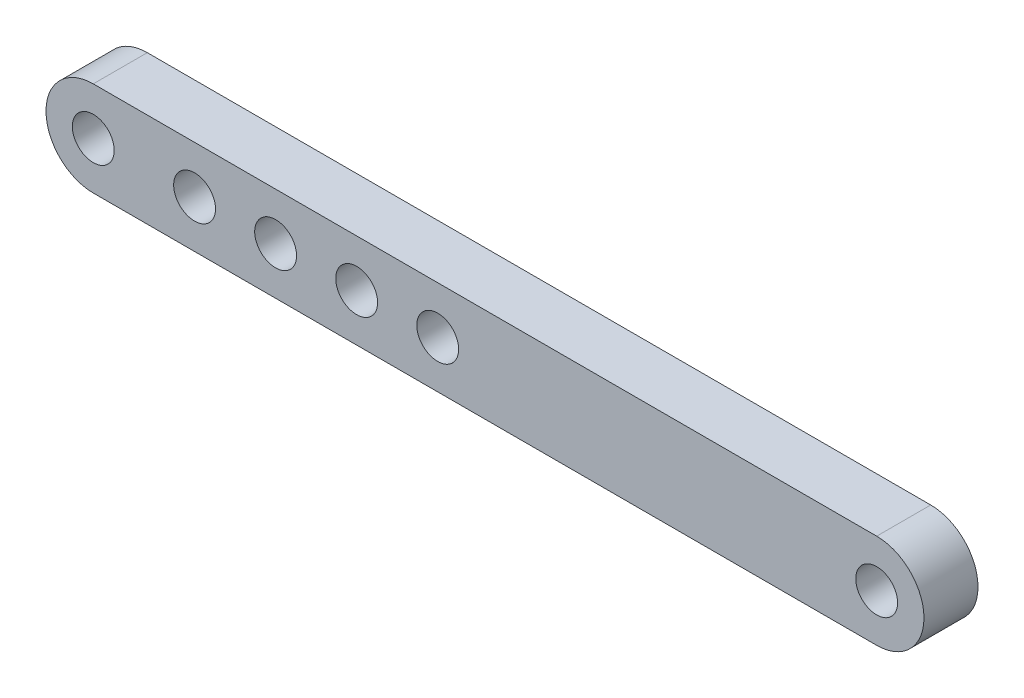
ISO-10303-21;
HEADER;
FILE_DESCRIPTION(('STEP AP214'),'2;1');
FILE_NAME('part.step','',(''),(''),'','','');
FILE_SCHEMA(('AUTOMOTIVE_DESIGN { 1 0 10303 214 1 1 1 1 }'));
ENDSEC;
DATA;
#1=APPLICATION_CONTEXT('core data for automotive mechanical design processes');
#2=APPLICATION_PROTOCOL_DEFINITION('international standard','automotive_design',2000,#1);
#3=PRODUCT_CONTEXT('',#1,'mechanical');
#4=PRODUCT('Part','Part','',(#3));
#5=PRODUCT_RELATED_PRODUCT_CATEGORY('part','',(#4));
#6=PRODUCT_DEFINITION_FORMATION('','',#4);
#7=PRODUCT_DEFINITION_CONTEXT('part definition',#1,'design');
#8=PRODUCT_DEFINITION('design','',#6,#7);
#9=PRODUCT_DEFINITION_SHAPE('','',#8);
#10=(LENGTH_UNIT() NAMED_UNIT(*) SI_UNIT(.MILLI.,.METRE.));
#11=(NAMED_UNIT(*) PLANE_ANGLE_UNIT() SI_UNIT($,.RADIAN.));
#12=(NAMED_UNIT(*) SI_UNIT($,.STERADIAN.) SOLID_ANGLE_UNIT());
#13=UNCERTAINTY_MEASURE_WITH_UNIT(LENGTH_MEASURE(1.E-05),#10,'distance_accuracy_value','');
#14=(GEOMETRIC_REPRESENTATION_CONTEXT(3) GLOBAL_UNCERTAINTY_ASSIGNED_CONTEXT((#13)) GLOBAL_UNIT_ASSIGNED_CONTEXT((#10,
#11,#12)) REPRESENTATION_CONTEXT('',''));
#15=CARTESIAN_POINT('',(0.,0.,0.));
#16=DIRECTION('',(0.,0.,1.));
#17=DIRECTION('',(1.,0.,0.));
#18=AXIS2_PLACEMENT_3D('',#15,#16,#17);
#19=CARTESIAN_POINT('',(-33.3096085409253,0.,4.));
#20=DIRECTION('',(0.,0.,-1.));
#21=DIRECTION('',(-1.,0.,0.));
#22=AXIS2_PLACEMENT_3D('',#19,#20,#21);
#23=CYLINDRICAL_SURFACE('',#22,3.5);
#24=CARTESIAN_POINT('',(-33.3096085409253,0.,0.));
#25=DIRECTION('',(0.,0.,1.));
#26=DIRECTION('',(1.,0.,0.));
#27=AXIS2_PLACEMENT_3D('',#24,#25,#26);
#28=CIRCLE('',#27,3.5);
#29=CARTESIAN_POINT('',(-33.3096085409253,3.5,0.));
#30=VERTEX_POINT('',#29);
#31=CARTESIAN_POINT('',(-33.3096085409253,-3.5,0.));
#32=VERTEX_POINT('',#31);
#33=EDGE_CURVE('E107',#30,#32,#28,.T.);
#34=ORIENTED_EDGE('',*,*,#33,.T.);
#35=DIRECTION('',(0.,0.,-1.));
#36=VECTOR('',#35,1.);
#37=CARTESIAN_POINT('',(-33.3096085409253,-3.5,4.));
#38=LINE('',#37,#36);
#39=CARTESIAN_POINT('',(-33.3096085409253,-3.5,4.));
#40=VERTEX_POINT('',#39);
#41=EDGE_CURVE('E11',#40,#32,#38,.T.);
#42=ORIENTED_EDGE('',*,*,#41,.F.);
#43=CARTESIAN_POINT('',(-33.3096085409253,0.,4.));
#44=DIRECTION('',(0.,0.,1.));
#45=DIRECTION('',(1.,0.,0.));
#46=AXIS2_PLACEMENT_3D('',#43,#44,#45);
#47=CIRCLE('',#46,3.5);
#48=CARTESIAN_POINT('',(-33.3096085409253,3.5,4.));
#49=VERTEX_POINT('',#48);
#50=EDGE_CURVE('E91',#49,#40,#47,.T.);
#51=ORIENTED_EDGE('',*,*,#50,.F.);
#52=DIRECTION('',(0.,0.,-1.));
#53=VECTOR('',#52,1.);
#54=CARTESIAN_POINT('',(-33.3096085409253,3.5,4.));
#55=LINE('',#54,#53);
#56=EDGE_CURVE('E103',#49,#30,#55,.T.);
#57=ORIENTED_EDGE('',*,*,#56,.T.);
#58=EDGE_LOOP('',(#34,#42,#51,#57));
#59=FACE_BOUND('',#58,.T.);
#60=ADVANCED_FACE('F39',(#59),#23,.T.);
#61=CARTESIAN_POINT('',(-33.3096085409253,-3.5,4.));
#62=DIRECTION('',(0.,1.,0.));
#63=DIRECTION('',(0.,0.,1.));
#64=AXIS2_PLACEMENT_3D('',#61,#62,#63);
#65=PLANE('',#64);
#66=DIRECTION('',(1.,0.,0.));
#67=VECTOR('',#66,1.);
#68=CARTESIAN_POINT('',(-33.3096085409253,-3.5,0.));
#69=LINE('',#68,#67);
#70=CARTESIAN_POINT('',(24.6903914590747,-3.5,0.));
#71=VERTEX_POINT('',#70);
#72=EDGE_CURVE('E96',#32,#71,#69,.T.);
#73=ORIENTED_EDGE('',*,*,#72,.T.);
#74=DIRECTION('',(0.,0.,-1.));
#75=VECTOR('',#74,1.);
#76=CARTESIAN_POINT('',(24.6903914590747,-3.5,4.));
#77=LINE('',#76,#75);
#78=CARTESIAN_POINT('',(24.6903914590747,-3.5,4.));
#79=VERTEX_POINT('',#78);
#80=EDGE_CURVE('E48',#79,#71,#77,.T.);
#81=ORIENTED_EDGE('',*,*,#80,.F.);
#82=DIRECTION('',(1.,0.,0.));
#83=VECTOR('',#82,1.);
#84=CARTESIAN_POINT('',(-33.3096085409253,-3.5,4.));
#85=LINE('',#84,#83);
#86=EDGE_CURVE('E86',#40,#79,#85,.T.);
#87=ORIENTED_EDGE('',*,*,#86,.F.);
#88=ORIENTED_EDGE('',*,*,#41,.T.);
#89=EDGE_LOOP('',(#73,#81,#87,#88));
#90=FACE_BOUND('',#89,.T.);
#91=ADVANCED_FACE('F95',(#90),#65,.F.);
#92=CARTESIAN_POINT('',(24.6903914590747,0.,4.));
#93=DIRECTION('',(0.,0.,-1.));
#94=DIRECTION('',(-1.,0.,0.));
#95=AXIS2_PLACEMENT_3D('',#92,#93,#94);
#96=CYLINDRICAL_SURFACE('',#95,3.5);
#97=CARTESIAN_POINT('',(24.6903914590747,0.,0.));
#98=DIRECTION('',(0.,0.,1.));
#99=DIRECTION('',(1.,0.,0.));
#100=AXIS2_PLACEMENT_3D('',#97,#98,#99);
#101=CIRCLE('',#100,3.5);
#102=CARTESIAN_POINT('',(24.6903914590747,3.5,0.));
#103=VERTEX_POINT('',#102);
#104=EDGE_CURVE('E73',#71,#103,#101,.T.);
#105=ORIENTED_EDGE('',*,*,#104,.T.);
#106=DIRECTION('',(0.,0.,-1.));
#107=VECTOR('',#106,1.);
#108=CARTESIAN_POINT('',(24.6903914590747,3.5,4.));
#109=LINE('',#108,#107);
#110=CARTESIAN_POINT('',(24.6903914590747,3.5,4.));
#111=VERTEX_POINT('',#110);
#112=EDGE_CURVE('E98',#111,#103,#109,.T.);
#113=ORIENTED_EDGE('',*,*,#112,.F.);
#114=CARTESIAN_POINT('',(24.6903914590747,0.,4.));
#115=DIRECTION('',(0.,0.,1.));
#116=DIRECTION('',(1.,0.,0.));
#117=AXIS2_PLACEMENT_3D('',#114,#115,#116);
#118=CIRCLE('',#117,3.5);
#119=EDGE_CURVE('E89',#79,#111,#118,.T.);
#120=ORIENTED_EDGE('',*,*,#119,.F.);
#121=ORIENTED_EDGE('',*,*,#80,.T.);
#122=EDGE_LOOP('',(#105,#113,#120,#121));
#123=FACE_BOUND('',#122,.T.);
#124=ADVANCED_FACE('F99',(#123),#96,.T.);
#125=CARTESIAN_POINT('',(-33.3096085409253,3.5,4.));
#126=DIRECTION('',(0.,-1.,0.));
#127=DIRECTION('',(0.,0.,-1.));
#128=AXIS2_PLACEMENT_3D('',#125,#126,#127);
#129=PLANE('',#128);
#130=DIRECTION('',(-1.,0.,0.));
#131=VECTOR('',#130,1.);
#132=CARTESIAN_POINT('',(-33.3096085409253,3.5,0.));
#133=LINE('',#132,#131);
#134=EDGE_CURVE('E79',#103,#30,#133,.T.);
#135=ORIENTED_EDGE('',*,*,#134,.T.);
#136=ORIENTED_EDGE('',*,*,#56,.F.);
#137=DIRECTION('',(-1.,0.,0.));
#138=VECTOR('',#137,1.);
#139=CARTESIAN_POINT('',(-33.3096085409253,3.5,4.));
#140=LINE('',#139,#138);
#141=EDGE_CURVE('E56',#111,#49,#140,.T.);
#142=ORIENTED_EDGE('',*,*,#141,.F.);
#143=ORIENTED_EDGE('',*,*,#112,.T.);
#144=EDGE_LOOP('',(#135,#136,#142,#143));
#145=FACE_BOUND('',#144,.T.);
#146=ADVANCED_FACE('F121',(#145),#129,.F.);
#147=CARTESIAN_POINT('',(-33.3096085409253,0.,4.));
#148=DIRECTION('',(0.,0.,1.));
#149=DIRECTION('',(1.,0.,0.));
#150=AXIS2_PLACEMENT_3D('',#147,#148,#149);
#151=PLANE('',#150);
#152=CARTESIAN_POINT('',(-33.3096085409253,0.,4.));
#153=DIRECTION('',(0.,0.,1.));
#154=DIRECTION('',(1.,0.,0.));
#155=AXIS2_PLACEMENT_3D('',#152,#153,#154);
#156=CIRCLE('',#155,1.55);
#157=CARTESIAN_POINT('',(-31.7596085409253,0.,4.));
#158=VERTEX_POINT('',#157);
#159=EDGE_CURVE('E111',#158,#158,#156,.T.);
#160=ORIENTED_EDGE('',*,*,#159,.F.);
#161=EDGE_LOOP('',(#160));
#162=FACE_BOUND('',#161,.T.);
#163=CARTESIAN_POINT('',(-7.80960854092528,0.,4.));
#164=DIRECTION('',(0.,0.,1.));
#165=DIRECTION('',(1.,0.,0.));
#166=AXIS2_PLACEMENT_3D('',#163,#164,#165);
#167=CIRCLE('',#166,1.55);
#168=CARTESIAN_POINT('',(-6.25960854092528,0.,4.));
#169=VERTEX_POINT('',#168);
#170=EDGE_CURVE('E151',#169,#169,#167,.T.);
#171=ORIENTED_EDGE('',*,*,#170,.F.);
#172=EDGE_LOOP('',(#171));
#173=FACE_BOUND('',#172,.T.);
#174=CARTESIAN_POINT('',(-19.8096085409253,0.,4.));
#175=DIRECTION('',(0.,0.,1.));
#176=DIRECTION('',(1.,0.,0.));
#177=AXIS2_PLACEMENT_3D('',#174,#175,#176);
#178=CIRCLE('',#177,1.55);
#179=CARTESIAN_POINT('',(-18.2596085409253,0.,4.));
#180=VERTEX_POINT('',#179);
#181=EDGE_CURVE('E141',#180,#180,#178,.T.);
#182=ORIENTED_EDGE('',*,*,#181,.F.);
#183=EDGE_LOOP('',(#182));
#184=FACE_BOUND('',#183,.T.);
#185=CARTESIAN_POINT('',(24.6903914590747,0.,4.));
#186=DIRECTION('',(0.,0.,1.));
#187=DIRECTION('',(1.,0.,0.));
#188=AXIS2_PLACEMENT_3D('',#185,#186,#187);
#189=CIRCLE('',#188,1.55);
#190=CARTESIAN_POINT('',(26.2403914590747,0.,4.));
#191=VERTEX_POINT('',#190);
#192=EDGE_CURVE('E132',#191,#191,#189,.T.);
#193=ORIENTED_EDGE('',*,*,#192,.F.);
#194=EDGE_LOOP('',(#193));
#195=FACE_BOUND('',#194,.T.);
#196=CARTESIAN_POINT('',(-25.8096085409253,0.,4.));
#197=DIRECTION('',(0.,0.,1.));
#198=DIRECTION('',(1.,0.,0.));
#199=AXIS2_PLACEMENT_3D('',#196,#197,#198);
#200=CIRCLE('',#199,1.55);
#201=CARTESIAN_POINT('',(-24.2596085409253,0.,4.));
#202=VERTEX_POINT('',#201);
#203=EDGE_CURVE('E133',#202,#202,#200,.T.);
#204=ORIENTED_EDGE('',*,*,#203,.F.);
#205=EDGE_LOOP('',(#204));
#206=FACE_BOUND('',#205,.T.);
#207=CARTESIAN_POINT('',(-13.8096085409253,0.,4.));
#208=DIRECTION('',(0.,0.,1.));
#209=DIRECTION('',(1.,0.,0.));
#210=AXIS2_PLACEMENT_3D('',#207,#208,#209);
#211=CIRCLE('',#210,1.55);
#212=CARTESIAN_POINT('',(-12.2596085409253,0.,4.));
#213=VERTEX_POINT('',#212);
#214=EDGE_CURVE('E150',#213,#213,#211,.T.);
#215=ORIENTED_EDGE('',*,*,#214,.F.);
#216=EDGE_LOOP('',(#215));
#217=FACE_BOUND('',#216,.T.);
#218=ORIENTED_EDGE('',*,*,#50,.T.);
#219=ORIENTED_EDGE('',*,*,#86,.T.);
#220=ORIENTED_EDGE('',*,*,#119,.T.);
#221=ORIENTED_EDGE('',*,*,#141,.T.);
#222=EDGE_LOOP('',(#218,#219,#220,#221));
#223=FACE_BOUND('',#222,.T.);
#224=ADVANCED_FACE('F87',(#162,#173,#184,#195,#206,#217,#223),#151,.T.);
#225=CARTESIAN_POINT('',(-33.3096085409253,0.,0.));
#226=DIRECTION('',(0.,0.,1.));
#227=DIRECTION('',(1.,0.,0.));
#228=AXIS2_PLACEMENT_3D('',#225,#226,#227);
#229=PLANE('',#228);
#230=CARTESIAN_POINT('',(-33.3096085409253,0.,0.));
#231=DIRECTION('',(0.,0.,1.));
#232=DIRECTION('',(1.,0.,0.));
#233=AXIS2_PLACEMENT_3D('',#230,#231,#232);
#234=CIRCLE('',#233,1.55);
#235=CARTESIAN_POINT('',(-31.7596085409253,0.,0.));
#236=VERTEX_POINT('',#235);
#237=EDGE_CURVE('E145',#236,#236,#234,.T.);
#238=ORIENTED_EDGE('',*,*,#237,.T.);
#239=EDGE_LOOP('',(#238));
#240=FACE_BOUND('',#239,.T.);
#241=CARTESIAN_POINT('',(-7.80960854092528,0.,0.));
#242=DIRECTION('',(0.,0.,1.));
#243=DIRECTION('',(1.,0.,0.));
#244=AXIS2_PLACEMENT_3D('',#241,#242,#243);
#245=CIRCLE('',#244,1.55);
#246=CARTESIAN_POINT('',(-6.25960854092528,0.,0.));
#247=VERTEX_POINT('',#246);
#248=EDGE_CURVE('E162',#247,#247,#245,.T.);
#249=ORIENTED_EDGE('',*,*,#248,.T.);
#250=EDGE_LOOP('',(#249));
#251=FACE_BOUND('',#250,.T.);
#252=CARTESIAN_POINT('',(-19.8096085409253,0.,0.));
#253=DIRECTION('',(0.,0.,1.));
#254=DIRECTION('',(1.,0.,0.));
#255=AXIS2_PLACEMENT_3D('',#252,#253,#254);
#256=CIRCLE('',#255,1.55);
#257=CARTESIAN_POINT('',(-18.2596085409253,0.,0.));
#258=VERTEX_POINT('',#257);
#259=EDGE_CURVE('E137',#258,#258,#256,.T.);
#260=ORIENTED_EDGE('',*,*,#259,.T.);
#261=EDGE_LOOP('',(#260));
#262=FACE_BOUND('',#261,.T.);
#263=CARTESIAN_POINT('',(24.6903914590747,0.,0.));
#264=DIRECTION('',(0.,0.,1.));
#265=DIRECTION('',(1.,0.,0.));
#266=AXIS2_PLACEMENT_3D('',#263,#264,#265);
#267=CIRCLE('',#266,1.55);
#268=CARTESIAN_POINT('',(26.2403914590747,0.,0.));
#269=VERTEX_POINT('',#268);
#270=EDGE_CURVE('E128',#269,#269,#267,.T.);
#271=ORIENTED_EDGE('',*,*,#270,.T.);
#272=EDGE_LOOP('',(#271));
#273=FACE_BOUND('',#272,.T.);
#274=CARTESIAN_POINT('',(-25.8096085409253,0.,0.));
#275=DIRECTION('',(0.,0.,1.));
#276=DIRECTION('',(1.,0.,0.));
#277=AXIS2_PLACEMENT_3D('',#274,#275,#276);
#278=CIRCLE('',#277,1.55);
#279=CARTESIAN_POINT('',(-24.2596085409253,0.,0.));
#280=VERTEX_POINT('',#279);
#281=EDGE_CURVE('E155',#280,#280,#278,.T.);
#282=ORIENTED_EDGE('',*,*,#281,.T.);
#283=EDGE_LOOP('',(#282));
#284=FACE_BOUND('',#283,.T.);
#285=CARTESIAN_POINT('',(-13.8096085409253,0.,0.));
#286=DIRECTION('',(0.,0.,1.));
#287=DIRECTION('',(1.,0.,0.));
#288=AXIS2_PLACEMENT_3D('',#285,#286,#287);
#289=CIRCLE('',#288,1.55);
#290=CARTESIAN_POINT('',(-12.2596085409253,0.,0.));
#291=VERTEX_POINT('',#290);
#292=EDGE_CURVE('E146',#291,#291,#289,.T.);
#293=ORIENTED_EDGE('',*,*,#292,.T.);
#294=EDGE_LOOP('',(#293));
#295=FACE_BOUND('',#294,.T.);
#296=ORIENTED_EDGE('',*,*,#33,.F.);
#297=ORIENTED_EDGE('',*,*,#134,.F.);
#298=ORIENTED_EDGE('',*,*,#104,.F.);
#299=ORIENTED_EDGE('',*,*,#72,.F.);
#300=EDGE_LOOP('',(#296,#297,#298,#299));
#301=FACE_BOUND('',#300,.T.);
#302=ADVANCED_FACE('F124',(#240,#251,#262,#273,#284,#295,#301),#229,.F.);
#303=CARTESIAN_POINT('',(-13.8096085409253,0.,4.));
#304=DIRECTION('',(0.,0.,-1.));
#305=DIRECTION('',(-1.,0.,0.));
#306=AXIS2_PLACEMENT_3D('',#303,#304,#305);
#307=CYLINDRICAL_SURFACE('',#306,1.55);
#308=ORIENTED_EDGE('',*,*,#214,.T.);
#309=EDGE_LOOP('',(#308));
#310=FACE_BOUND('',#309,.T.);
#311=ORIENTED_EDGE('',*,*,#292,.F.);
#312=EDGE_LOOP('',(#311));
#313=FACE_BOUND('',#312,.T.);
#314=ADVANCED_FACE('F192',(#310,#313),#307,.F.);
#315=CARTESIAN_POINT('',(-25.8096085409253,0.,4.));
#316=DIRECTION('',(0.,0.,-1.));
#317=DIRECTION('',(-1.,0.,0.));
#318=AXIS2_PLACEMENT_3D('',#315,#316,#317);
#319=CYLINDRICAL_SURFACE('',#318,1.55);
#320=ORIENTED_EDGE('',*,*,#203,.T.);
#321=EDGE_LOOP('',(#320));
#322=FACE_BOUND('',#321,.T.);
#323=ORIENTED_EDGE('',*,*,#281,.F.);
#324=EDGE_LOOP('',(#323));
#325=FACE_BOUND('',#324,.T.);
#326=ADVANCED_FACE('F195',(#322,#325),#319,.F.);
#327=CARTESIAN_POINT('',(24.6903914590747,0.,4.));
#328=DIRECTION('',(0.,0.,-1.));
#329=DIRECTION('',(-1.,0.,0.));
#330=AXIS2_PLACEMENT_3D('',#327,#328,#329);
#331=CYLINDRICAL_SURFACE('',#330,1.55);
#332=ORIENTED_EDGE('',*,*,#192,.T.);
#333=EDGE_LOOP('',(#332));
#334=FACE_BOUND('',#333,.T.);
#335=ORIENTED_EDGE('',*,*,#270,.F.);
#336=EDGE_LOOP('',(#335));
#337=FACE_BOUND('',#336,.T.);
#338=ADVANCED_FACE('F242',(#334,#337),#331,.F.);
#339=CARTESIAN_POINT('',(-19.8096085409253,0.,4.));
#340=DIRECTION('',(0.,0.,-1.));
#341=DIRECTION('',(-1.,0.,0.));
#342=AXIS2_PLACEMENT_3D('',#339,#340,#341);
#343=CYLINDRICAL_SURFACE('',#342,1.55);
#344=ORIENTED_EDGE('',*,*,#181,.T.);
#345=EDGE_LOOP('',(#344));
#346=FACE_BOUND('',#345,.T.);
#347=ORIENTED_EDGE('',*,*,#259,.F.);
#348=EDGE_LOOP('',(#347));
#349=FACE_BOUND('',#348,.T.);
#350=ADVANCED_FACE('F252',(#346,#349),#343,.F.);
#351=CARTESIAN_POINT('',(-7.80960854092528,0.,4.));
#352=DIRECTION('',(0.,0.,-1.));
#353=DIRECTION('',(-1.,0.,0.));
#354=AXIS2_PLACEMENT_3D('',#351,#352,#353);
#355=CYLINDRICAL_SURFACE('',#354,1.55);
#356=ORIENTED_EDGE('',*,*,#170,.T.);
#357=EDGE_LOOP('',(#356));
#358=FACE_BOUND('',#357,.T.);
#359=ORIENTED_EDGE('',*,*,#248,.F.);
#360=EDGE_LOOP('',(#359));
#361=FACE_BOUND('',#360,.T.);
#362=ADVANCED_FACE('F262',(#358,#361),#355,.F.);
#363=CARTESIAN_POINT('',(-33.3096085409253,0.,4.));
#364=DIRECTION('',(0.,0.,-1.));
#365=DIRECTION('',(-1.,0.,0.));
#366=AXIS2_PLACEMENT_3D('',#363,#364,#365);
#367=CYLINDRICAL_SURFACE('',#366,1.55);
#368=ORIENTED_EDGE('',*,*,#159,.T.);
#369=EDGE_LOOP('',(#368));
#370=FACE_BOUND('',#369,.T.);
#371=ORIENTED_EDGE('',*,*,#237,.F.);
#372=EDGE_LOOP('',(#371));
#373=FACE_BOUND('',#372,.T.);
#374=ADVANCED_FACE('F176',(#370,#373),#367,.F.);
#375=CLOSED_SHELL('',(#60,#91,#124,#146,#224,#302,#314,#326,#338,#350,#362,#374));
#376=MANIFOLD_SOLID_BREP('B2',#375);
#377=ADVANCED_BREP_SHAPE_REPRESENTATION('',(#18,#376),#14);
#378=SHAPE_DEFINITION_REPRESENTATION(#9,#377);
ENDSEC;
END-ISO-10303-21;
